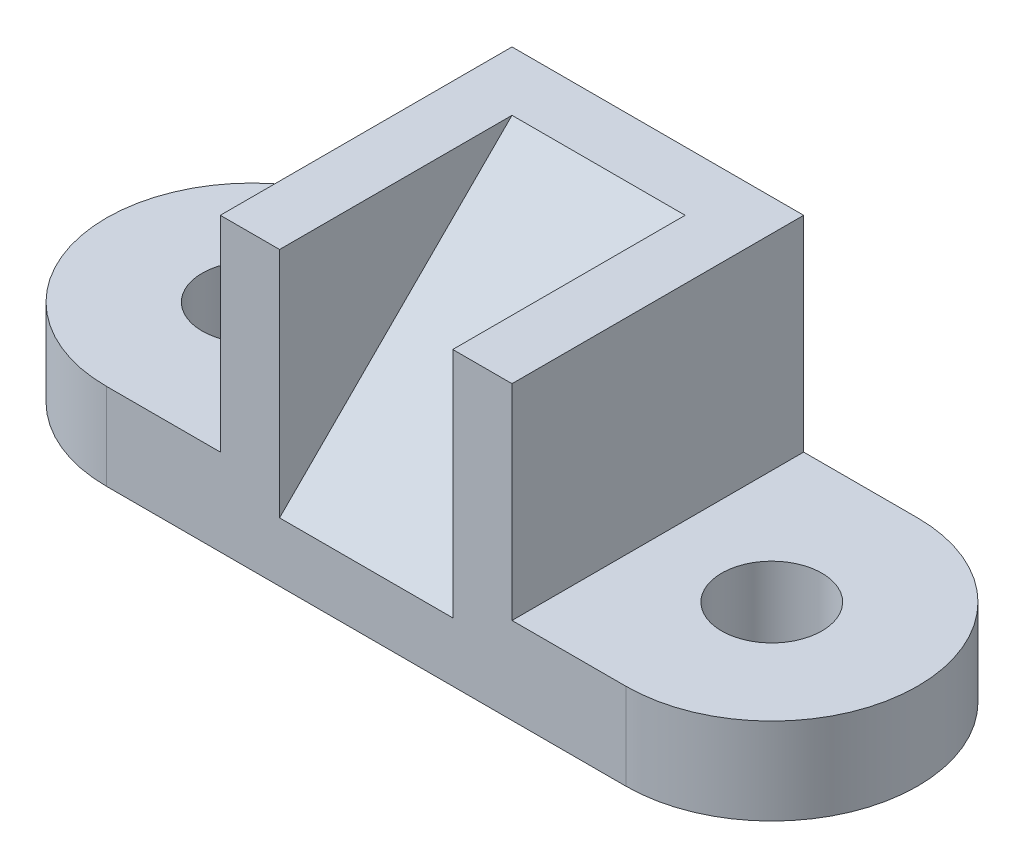
ISO-10303-21;
HEADER;
FILE_DESCRIPTION(('STEP AP214'),'2;1');
FILE_NAME('part.step','',(''),(''),'','','');
FILE_SCHEMA(('AUTOMOTIVE_DESIGN { 1 0 10303 214 1 1 1 1 }'));
ENDSEC;
DATA;
#1=APPLICATION_CONTEXT('core data for automotive mechanical design processes');
#2=APPLICATION_PROTOCOL_DEFINITION('international standard','automotive_design',2000,#1);
#3=PRODUCT_CONTEXT('',#1,'mechanical');
#4=PRODUCT('Part','Part','',(#3));
#5=PRODUCT_RELATED_PRODUCT_CATEGORY('part','',(#4));
#6=PRODUCT_DEFINITION_FORMATION('','',#4);
#7=PRODUCT_DEFINITION_CONTEXT('part definition',#1,'design');
#8=PRODUCT_DEFINITION('design','',#6,#7);
#9=PRODUCT_DEFINITION_SHAPE('','',#8);
#10=(LENGTH_UNIT() NAMED_UNIT(*) SI_UNIT(.MILLI.,.METRE.));
#11=(NAMED_UNIT(*) PLANE_ANGLE_UNIT() SI_UNIT($,.RADIAN.));
#12=(NAMED_UNIT(*) SI_UNIT($,.STERADIAN.) SOLID_ANGLE_UNIT());
#13=UNCERTAINTY_MEASURE_WITH_UNIT(LENGTH_MEASURE(1.E-05),#10,'distance_accuracy_value','');
#14=(GEOMETRIC_REPRESENTATION_CONTEXT(3) GLOBAL_UNCERTAINTY_ASSIGNED_CONTEXT((#13)) GLOBAL_UNIT_ASSIGNED_CONTEXT((#10,
#11,#12)) REPRESENTATION_CONTEXT('',''));
#15=CARTESIAN_POINT('',(0.,0.,0.));
#16=DIRECTION('',(0.,0.,1.));
#17=DIRECTION('',(1.,0.,0.));
#18=AXIS2_PLACEMENT_3D('',#15,#16,#17);
#19=CARTESIAN_POINT('',(0.,19.,0.));
#20=DIRECTION('',(0.,1.,0.));
#21=DIRECTION('',(0.,0.,1.));
#22=AXIS2_PLACEMENT_3D('',#19,#20,#21);
#23=PLANE('',#22);
#24=DIRECTION('',(0.,0.,1.));
#25=VECTOR('',#24,1.);
#26=CARTESIAN_POINT('',(25.,19.,-32.));
#27=LINE('',#26,#25);
#28=CARTESIAN_POINT('',(25.,19.,-32.));
#29=VERTEX_POINT('',#28);
#30=CARTESIAN_POINT('',(25.,19.,32.));
#31=VERTEX_POINT('',#30);
#32=EDGE_CURVE('E62',#29,#31,#27,.T.);
#33=ORIENTED_EDGE('',*,*,#32,.F.);
#34=DIRECTION('',(-1.,0.,0.));
#35=VECTOR('',#34,1.);
#36=CARTESIAN_POINT('',(0.,19.,-32.));
#37=LINE('',#36,#35);
#38=CARTESIAN_POINT('',(0.,19.,-32.));
#39=VERTEX_POINT('',#38);
#40=EDGE_CURVE('E196',#29,#39,#37,.T.);
#41=ORIENTED_EDGE('',*,*,#40,.T.);
#42=CARTESIAN_POINT('',(0.,19.,0.));
#43=DIRECTION('',(0.,1.,0.));
#44=DIRECTION('',(0.,0.,1.));
#45=AXIS2_PLACEMENT_3D('',#42,#43,#44);
#46=CIRCLE('',#45,32.);
#47=CARTESIAN_POINT('',(0.,19.,32.));
#48=VERTEX_POINT('',#47);
#49=EDGE_CURVE('E187',#39,#48,#46,.T.);
#50=ORIENTED_EDGE('',*,*,#49,.T.);
#51=DIRECTION('',(1.,0.,0.));
#52=VECTOR('',#51,1.);
#53=CARTESIAN_POINT('',(0.,19.,32.));
#54=LINE('',#53,#52);
#55=EDGE_CURVE('E192',#48,#31,#54,.T.);
#56=ORIENTED_EDGE('',*,*,#55,.T.);
#57=EDGE_LOOP('',(#33,#41,#50,#56));
#58=FACE_BOUND('',#57,.T.);
#59=CARTESIAN_POINT('',(0.,19.,0.));
#60=DIRECTION('',(0.,1.,0.));
#61=DIRECTION('',(0.,0.,1.));
#62=AXIS2_PLACEMENT_3D('',#59,#60,#61);
#63=CIRCLE('',#62,11.);
#64=CARTESIAN_POINT('',(0.,19.,11.));
#65=VERTEX_POINT('',#64);
#66=EDGE_CURVE('E181',#65,#65,#63,.T.);
#67=ORIENTED_EDGE('',*,*,#66,.F.);
#68=EDGE_LOOP('',(#67));
#69=FACE_BOUND('',#68,.T.);
#70=ADVANCED_FACE('F39',(#58,#69),#23,.T.);
#71=DIRECTION('',(0.,0.,-1.));
#72=VECTOR('',#71,1.);
#73=CARTESIAN_POINT('',(89.,19.,-32.));
#74=LINE('',#73,#72);
#75=CARTESIAN_POINT('',(89.,19.,32.));
#76=VERTEX_POINT('',#75);
#77=CARTESIAN_POINT('',(89.,19.,-32.));
#78=VERTEX_POINT('',#77);
#79=EDGE_CURVE('E152',#76,#78,#74,.T.);
#80=ORIENTED_EDGE('',*,*,#79,.F.);
#81=CARTESIAN_POINT('',(114.,19.,32.));
#82=VERTEX_POINT('',#81);
#83=EDGE_CURVE('E190',#76,#82,#54,.T.);
#84=ORIENTED_EDGE('',*,*,#83,.T.);
#85=CARTESIAN_POINT('',(114.,19.,0.));
#86=DIRECTION('',(0.,1.,0.));
#87=DIRECTION('',(0.,0.,1.));
#88=AXIS2_PLACEMENT_3D('',#85,#86,#87);
#89=CIRCLE('',#88,32.);
#90=CARTESIAN_POINT('',(114.,19.,-32.));
#91=VERTEX_POINT('',#90);
#92=EDGE_CURVE('E194',#82,#91,#89,.T.);
#93=ORIENTED_EDGE('',*,*,#92,.T.);
#94=EDGE_CURVE('E197',#91,#78,#37,.T.);
#95=ORIENTED_EDGE('',*,*,#94,.T.);
#96=EDGE_LOOP('',(#80,#84,#93,#95));
#97=FACE_BOUND('',#96,.T.);
#98=CARTESIAN_POINT('',(114.,19.,0.));
#99=DIRECTION('',(0.,1.,0.));
#100=DIRECTION('',(0.,0.,1.));
#101=AXIS2_PLACEMENT_3D('',#98,#99,#100);
#102=CIRCLE('',#101,11.);
#103=CARTESIAN_POINT('',(114.,19.,11.));
#104=VERTEX_POINT('',#103);
#105=EDGE_CURVE('E175',#104,#104,#102,.T.);
#106=ORIENTED_EDGE('',*,*,#105,.F.);
#107=EDGE_LOOP('',(#106));
#108=FACE_BOUND('',#107,.T.);
#109=ADVANCED_FACE('F245',(#97,#108),#23,.T.);
#110=CARTESIAN_POINT('',(0.,0.,0.));
#111=DIRECTION('',(0.,1.,0.));
#112=DIRECTION('',(0.,0.,1.));
#113=AXIS2_PLACEMENT_3D('',#110,#111,#112);
#114=PLANE('',#113);
#115=CARTESIAN_POINT('',(0.,0.,0.));
#116=DIRECTION('',(0.,1.,0.));
#117=DIRECTION('',(0.,0.,1.));
#118=AXIS2_PLACEMENT_3D('',#115,#116,#117);
#119=CIRCLE('',#118,32.);
#120=CARTESIAN_POINT('',(0.,0.,-32.));
#121=VERTEX_POINT('',#120);
#122=CARTESIAN_POINT('',(0.,0.,32.));
#123=VERTEX_POINT('',#122);
#124=EDGE_CURVE('E184',#121,#123,#119,.T.);
#125=ORIENTED_EDGE('',*,*,#124,.F.);
#126=DIRECTION('',(-1.,0.,0.));
#127=VECTOR('',#126,1.);
#128=CARTESIAN_POINT('',(0.,0.,-32.));
#129=LINE('',#128,#127);
#130=CARTESIAN_POINT('',(114.,0.,-32.));
#131=VERTEX_POINT('',#130);
#132=EDGE_CURVE('E191',#131,#121,#129,.T.);
#133=ORIENTED_EDGE('',*,*,#132,.F.);
#134=CARTESIAN_POINT('',(114.,0.,0.));
#135=DIRECTION('',(0.,1.,0.));
#136=DIRECTION('',(0.,0.,1.));
#137=AXIS2_PLACEMENT_3D('',#134,#135,#136);
#138=CIRCLE('',#137,32.);
#139=CARTESIAN_POINT('',(114.,0.,32.));
#140=VERTEX_POINT('',#139);
#141=EDGE_CURVE('E204',#140,#131,#138,.T.);
#142=ORIENTED_EDGE('',*,*,#141,.F.);
#143=DIRECTION('',(1.,0.,0.));
#144=VECTOR('',#143,1.);
#145=CARTESIAN_POINT('',(0.,0.,32.));
#146=LINE('',#145,#144);
#147=EDGE_CURVE('E202',#123,#140,#146,.T.);
#148=ORIENTED_EDGE('',*,*,#147,.F.);
#149=EDGE_LOOP('',(#125,#133,#142,#148));
#150=FACE_BOUND('',#149,.T.);
#151=CARTESIAN_POINT('',(0.,0.,0.));
#152=DIRECTION('',(0.,1.,0.));
#153=DIRECTION('',(0.,0.,1.));
#154=AXIS2_PLACEMENT_3D('',#151,#152,#153);
#155=CIRCLE('',#154,11.);
#156=CARTESIAN_POINT('',(0.,0.,11.));
#157=VERTEX_POINT('',#156);
#158=EDGE_CURVE('E178',#157,#157,#155,.T.);
#159=ORIENTED_EDGE('',*,*,#158,.T.);
#160=EDGE_LOOP('',(#159));
#161=FACE_BOUND('',#160,.T.);
#162=CARTESIAN_POINT('',(114.,0.,0.));
#163=DIRECTION('',(0.,1.,0.));
#164=DIRECTION('',(0.,0.,1.));
#165=AXIS2_PLACEMENT_3D('',#162,#163,#164);
#166=CIRCLE('',#165,11.);
#167=CARTESIAN_POINT('',(114.,0.,11.));
#168=VERTEX_POINT('',#167);
#169=EDGE_CURVE('E174',#168,#168,#166,.T.);
#170=ORIENTED_EDGE('',*,*,#169,.T.);
#171=EDGE_LOOP('',(#170));
#172=FACE_BOUND('',#171,.T.);
#173=ADVANCED_FACE('F223',(#150,#161,#172),#114,.F.);
#174=CARTESIAN_POINT('',(0.,19.,0.));
#175=DIRECTION('',(0.,-1.,0.));
#176=DIRECTION('',(0.,0.,-1.));
#177=AXIS2_PLACEMENT_3D('',#174,#175,#176);
#178=CYLINDRICAL_SURFACE('',#177,32.);
#179=ORIENTED_EDGE('',*,*,#124,.T.);
#180=DIRECTION('',(0.,-1.,0.));
#181=VECTOR('',#180,1.);
#182=CARTESIAN_POINT('',(0.,19.,32.));
#183=LINE('',#182,#181);
#184=EDGE_CURVE('E11',#48,#123,#183,.T.);
#185=ORIENTED_EDGE('',*,*,#184,.F.);
#186=ORIENTED_EDGE('',*,*,#49,.F.);
#187=DIRECTION('',(0.,-1.,0.));
#188=VECTOR('',#187,1.);
#189=CARTESIAN_POINT('',(0.,19.,-32.));
#190=LINE('',#189,#188);
#191=EDGE_CURVE('E199',#39,#121,#190,.T.);
#192=ORIENTED_EDGE('',*,*,#191,.T.);
#193=EDGE_LOOP('',(#179,#185,#186,#192));
#194=FACE_BOUND('',#193,.T.);
#195=ADVANCED_FACE('F41',(#194),#178,.T.);
#196=CARTESIAN_POINT('',(0.,19.,32.));
#197=DIRECTION('',(0.,0.,-1.));
#198=DIRECTION('',(-1.,0.,0.));
#199=AXIS2_PLACEMENT_3D('',#196,#197,#198);
#200=PLANE('',#199);
#201=DIRECTION('',(1.,0.,0.));
#202=VECTOR('',#201,1.);
#203=CARTESIAN_POINT('',(25.,64.,32.));
#204=LINE('',#203,#202);
#205=CARTESIAN_POINT('',(76.,64.,32.));
#206=VERTEX_POINT('',#205);
#207=CARTESIAN_POINT('',(89.,64.,32.));
#208=VERTEX_POINT('',#207);
#209=EDGE_CURVE('E151',#206,#208,#204,.T.);
#210=ORIENTED_EDGE('',*,*,#209,.F.);
#211=DIRECTION('',(0.,1.,0.));
#212=VECTOR('',#211,1.);
#213=CARTESIAN_POINT('',(76.,13.,32.));
#214=LINE('',#213,#212);
#215=CARTESIAN_POINT('',(76.,13.,32.));
#216=VERTEX_POINT('',#215);
#217=EDGE_CURVE('E131',#216,#206,#214,.T.);
#218=ORIENTED_EDGE('',*,*,#217,.F.);
#219=DIRECTION('',(-1.,0.,0.));
#220=VECTOR('',#219,1.);
#221=CARTESIAN_POINT('',(76.,13.,32.));
#222=LINE('',#221,#220);
#223=CARTESIAN_POINT('',(38.,13.,32.));
#224=VERTEX_POINT('',#223);
#225=EDGE_CURVE('E128',#216,#224,#222,.T.);
#226=ORIENTED_EDGE('',*,*,#225,.T.);
#227=DIRECTION('',(0.,1.,0.));
#228=VECTOR('',#227,1.);
#229=CARTESIAN_POINT('',(38.,13.,32.));
#230=LINE('',#229,#228);
#231=CARTESIAN_POINT('',(38.,64.,32.));
#232=VERTEX_POINT('',#231);
#233=EDGE_CURVE('E138',#224,#232,#230,.T.);
#234=ORIENTED_EDGE('',*,*,#233,.T.);
#235=CARTESIAN_POINT('',(25.,64.,32.));
#236=VERTEX_POINT('',#235);
#237=EDGE_CURVE('E153',#236,#232,#204,.T.);
#238=ORIENTED_EDGE('',*,*,#237,.F.);
#239=DIRECTION('',(0.,-1.,0.));
#240=VECTOR('',#239,1.);
#241=CARTESIAN_POINT('',(25.,64.,32.));
#242=LINE('',#241,#240);
#243=EDGE_CURVE('E171',#236,#31,#242,.T.);
#244=ORIENTED_EDGE('',*,*,#243,.T.);
#245=ORIENTED_EDGE('',*,*,#55,.F.);
#246=ORIENTED_EDGE('',*,*,#184,.T.);
#247=ORIENTED_EDGE('',*,*,#147,.T.);
#248=DIRECTION('',(0.,-1.,0.));
#249=VECTOR('',#248,1.);
#250=CARTESIAN_POINT('',(114.,19.,32.));
#251=LINE('',#250,#249);
#252=EDGE_CURVE('E47',#82,#140,#251,.T.);
#253=ORIENTED_EDGE('',*,*,#252,.F.);
#254=ORIENTED_EDGE('',*,*,#83,.F.);
#255=DIRECTION('',(0.,-1.,0.));
#256=VECTOR('',#255,1.);
#257=CARTESIAN_POINT('',(89.,64.,32.));
#258=LINE('',#257,#256);
#259=EDGE_CURVE('E168',#208,#76,#258,.T.);
#260=ORIENTED_EDGE('',*,*,#259,.F.);
#261=EDGE_LOOP('',(#210,#218,#226,#234,#238,#244,#245,#246,#247,#253,#254,#260));
#262=FACE_BOUND('',#261,.T.);
#263=ADVANCED_FACE('F247',(#262),#200,.F.);
#264=CARTESIAN_POINT('',(114.,19.,0.));
#265=DIRECTION('',(0.,-1.,0.));
#266=DIRECTION('',(0.,0.,-1.));
#267=AXIS2_PLACEMENT_3D('',#264,#265,#266);
#268=CYLINDRICAL_SURFACE('',#267,32.);
#269=ORIENTED_EDGE('',*,*,#141,.T.);
#270=DIRECTION('',(0.,-1.,0.));
#271=VECTOR('',#270,1.);
#272=CARTESIAN_POINT('',(114.,19.,-32.));
#273=LINE('',#272,#271);
#274=EDGE_CURVE('E209',#91,#131,#273,.T.);
#275=ORIENTED_EDGE('',*,*,#274,.F.);
#276=ORIENTED_EDGE('',*,*,#92,.F.);
#277=ORIENTED_EDGE('',*,*,#252,.T.);
#278=EDGE_LOOP('',(#269,#275,#276,#277));
#279=FACE_BOUND('',#278,.T.);
#280=ADVANCED_FACE('F216',(#279),#268,.T.);
#281=CARTESIAN_POINT('',(0.,19.,-32.));
#282=DIRECTION('',(0.,0.,1.));
#283=DIRECTION('',(1.,0.,0.));
#284=AXIS2_PLACEMENT_3D('',#281,#282,#283);
#285=PLANE('',#284);
#286=ORIENTED_EDGE('',*,*,#132,.T.);
#287=ORIENTED_EDGE('',*,*,#191,.F.);
#288=ORIENTED_EDGE('',*,*,#40,.F.);
#289=DIRECTION('',(0.,-1.,0.));
#290=VECTOR('',#289,1.);
#291=CARTESIAN_POINT('',(25.,64.,-32.));
#292=LINE('',#291,#290);
#293=CARTESIAN_POINT('',(25.,64.,-32.));
#294=VERTEX_POINT('',#293);
#295=EDGE_CURVE('E159',#294,#29,#292,.T.);
#296=ORIENTED_EDGE('',*,*,#295,.F.);
#297=DIRECTION('',(-1.,0.,0.));
#298=VECTOR('',#297,1.);
#299=CARTESIAN_POINT('',(25.,64.,-32.));
#300=LINE('',#299,#298);
#301=CARTESIAN_POINT('',(89.,64.,-32.));
#302=VERTEX_POINT('',#301);
#303=EDGE_CURVE('E157',#302,#294,#300,.T.);
#304=ORIENTED_EDGE('',*,*,#303,.F.);
#305=DIRECTION('',(0.,-1.,0.));
#306=VECTOR('',#305,1.);
#307=CARTESIAN_POINT('',(89.,64.,-32.));
#308=LINE('',#307,#306);
#309=EDGE_CURVE('E165',#302,#78,#308,.T.);
#310=ORIENTED_EDGE('',*,*,#309,.T.);
#311=ORIENTED_EDGE('',*,*,#94,.F.);
#312=ORIENTED_EDGE('',*,*,#274,.T.);
#313=EDGE_LOOP('',(#286,#287,#288,#296,#304,#310,#311,#312));
#314=FACE_BOUND('',#313,.T.);
#315=ADVANCED_FACE('F227',(#314),#285,.F.);
#316=CARTESIAN_POINT('',(0.,19.,0.));
#317=DIRECTION('',(0.,-1.,0.));
#318=DIRECTION('',(0.,0.,-1.));
#319=AXIS2_PLACEMENT_3D('',#316,#317,#318);
#320=CYLINDRICAL_SURFACE('',#319,11.);
#321=ORIENTED_EDGE('',*,*,#66,.T.);
#322=EDGE_LOOP('',(#321));
#323=FACE_BOUND('',#322,.T.);
#324=ORIENTED_EDGE('',*,*,#158,.F.);
#325=EDGE_LOOP('',(#324));
#326=FACE_BOUND('',#325,.T.);
#327=ADVANCED_FACE('F267',(#323,#326),#320,.F.);
#328=CARTESIAN_POINT('',(114.,19.,0.));
#329=DIRECTION('',(0.,-1.,0.));
#330=DIRECTION('',(0.,0.,-1.));
#331=AXIS2_PLACEMENT_3D('',#328,#329,#330);
#332=CYLINDRICAL_SURFACE('',#331,11.);
#333=ORIENTED_EDGE('',*,*,#105,.T.);
#334=EDGE_LOOP('',(#333));
#335=FACE_BOUND('',#334,.T.);
#336=ORIENTED_EDGE('',*,*,#169,.F.);
#337=EDGE_LOOP('',(#336));
#338=FACE_BOUND('',#337,.T.);
#339=ADVANCED_FACE('F297',(#335,#338),#332,.F.);
#340=CARTESIAN_POINT('',(25.,64.,-32.));
#341=DIRECTION('',(1.,0.,0.));
#342=DIRECTION('',(0.,0.,-1.));
#343=AXIS2_PLACEMENT_3D('',#340,#341,#342);
#344=PLANE('',#343);
#345=ORIENTED_EDGE('',*,*,#32,.T.);
#346=ORIENTED_EDGE('',*,*,#243,.F.);
#347=DIRECTION('',(0.,0.,1.));
#348=VECTOR('',#347,1.);
#349=CARTESIAN_POINT('',(25.,64.,-32.));
#350=LINE('',#349,#348);
#351=EDGE_CURVE('E148',#294,#236,#350,.T.);
#352=ORIENTED_EDGE('',*,*,#351,.F.);
#353=ORIENTED_EDGE('',*,*,#295,.T.);
#354=EDGE_LOOP('',(#345,#346,#352,#353));
#355=FACE_BOUND('',#354,.T.);
#356=ADVANCED_FACE('F237',(#355),#344,.F.);
#357=CARTESIAN_POINT('',(89.,64.,-32.));
#358=DIRECTION('',(-1.,0.,0.));
#359=DIRECTION('',(0.,0.,1.));
#360=AXIS2_PLACEMENT_3D('',#357,#358,#359);
#361=PLANE('',#360);
#362=ORIENTED_EDGE('',*,*,#79,.T.);
#363=ORIENTED_EDGE('',*,*,#309,.F.);
#364=DIRECTION('',(0.,0.,-1.));
#365=VECTOR('',#364,1.);
#366=CARTESIAN_POINT('',(89.,64.,-32.));
#367=LINE('',#366,#365);
#368=EDGE_CURVE('E155',#208,#302,#367,.T.);
#369=ORIENTED_EDGE('',*,*,#368,.F.);
#370=ORIENTED_EDGE('',*,*,#259,.T.);
#371=EDGE_LOOP('',(#362,#363,#369,#370));
#372=FACE_BOUND('',#371,.T.);
#373=ADVANCED_FACE('F242',(#372),#361,.F.);
#374=CARTESIAN_POINT('',(0.,64.,0.));
#375=DIRECTION('',(0.,1.,0.));
#376=DIRECTION('',(0.,0.,1.));
#377=AXIS2_PLACEMENT_3D('',#374,#375,#376);
#378=PLANE('',#377);
#379=DIRECTION('',(0.,0.,-1.));
#380=VECTOR('',#379,1.);
#381=CARTESIAN_POINT('',(76.,64.,32.));
#382=LINE('',#381,#380);
#383=CARTESIAN_POINT('',(76.,64.,-19.));
#384=VERTEX_POINT('',#383);
#385=EDGE_CURVE('E132',#206,#384,#382,.T.);
#386=ORIENTED_EDGE('',*,*,#385,.F.);
#387=ORIENTED_EDGE('',*,*,#209,.T.);
#388=ORIENTED_EDGE('',*,*,#368,.T.);
#389=ORIENTED_EDGE('',*,*,#303,.T.);
#390=ORIENTED_EDGE('',*,*,#351,.T.);
#391=ORIENTED_EDGE('',*,*,#237,.T.);
#392=DIRECTION('',(0.,0.,-1.));
#393=VECTOR('',#392,1.);
#394=CARTESIAN_POINT('',(38.,64.,32.));
#395=LINE('',#394,#393);
#396=CARTESIAN_POINT('',(38.,64.,-19.));
#397=VERTEX_POINT('',#396);
#398=EDGE_CURVE('E142',#232,#397,#395,.T.);
#399=ORIENTED_EDGE('',*,*,#398,.T.);
#400=DIRECTION('',(-1.,0.,0.));
#401=VECTOR('',#400,1.);
#402=CARTESIAN_POINT('',(76.,64.,-19.));
#403=LINE('',#402,#401);
#404=EDGE_CURVE('E125',#384,#397,#403,.T.);
#405=ORIENTED_EDGE('',*,*,#404,.F.);
#406=EDGE_LOOP('',(#386,#387,#388,#389,#390,#391,#399,#405));
#407=FACE_BOUND('',#406,.T.);
#408=ADVANCED_FACE('F140',(#407),#378,.T.);
#409=CARTESIAN_POINT('',(76.,64.,-19.));
#410=DIRECTION('',(0.,-0.707106781186548,-0.707106781186548));
#411=DIRECTION('',(0.,0.707106781186548,-0.707106781186547));
#412=AXIS2_PLACEMENT_3D('',#409,#410,#411);
#413=PLANE('',#412);
#414=DIRECTION('',(0.,-0.707106781186548,0.707106781186547));
#415=VECTOR('',#414,1.);
#416=CARTESIAN_POINT('',(38.,64.,-19.));
#417=LINE('',#416,#415);
#418=EDGE_CURVE('E54',#397,#224,#417,.T.);
#419=ORIENTED_EDGE('',*,*,#418,.T.);
#420=ORIENTED_EDGE('',*,*,#225,.F.);
#421=DIRECTION('',(0.,-0.707106781186548,0.707106781186547));
#422=VECTOR('',#421,1.);
#423=CARTESIAN_POINT('',(76.,64.,-19.));
#424=LINE('',#423,#422);
#425=EDGE_CURVE('E121',#384,#216,#424,.T.);
#426=ORIENTED_EDGE('',*,*,#425,.F.);
#427=ORIENTED_EDGE('',*,*,#404,.T.);
#428=EDGE_LOOP('',(#419,#420,#426,#427));
#429=FACE_BOUND('',#428,.T.);
#430=ADVANCED_FACE('F123',(#429),#413,.F.);
#431=CARTESIAN_POINT('',(76.,0.,0.));
#432=DIRECTION('',(1.,0.,0.));
#433=DIRECTION('',(0.,0.,-1.));
#434=AXIS2_PLACEMENT_3D('',#431,#432,#433);
#435=PLANE('',#434);
#436=ORIENTED_EDGE('',*,*,#385,.T.);
#437=ORIENTED_EDGE('',*,*,#425,.T.);
#438=ORIENTED_EDGE('',*,*,#217,.T.);
#439=EDGE_LOOP('',(#436,#437,#438));
#440=FACE_BOUND('',#439,.T.);
#441=ADVANCED_FACE('F135',(#440),#435,.F.);
#442=CARTESIAN_POINT('',(38.,0.,0.));
#443=DIRECTION('',(1.,0.,0.));
#444=DIRECTION('',(0.,0.,-1.));
#445=AXIS2_PLACEMENT_3D('',#442,#443,#444);
#446=PLANE('',#445);
#447=ORIENTED_EDGE('',*,*,#398,.F.);
#448=ORIENTED_EDGE('',*,*,#233,.F.);
#449=ORIENTED_EDGE('',*,*,#418,.F.);
#450=EDGE_LOOP('',(#447,#448,#449));
#451=FACE_BOUND('',#450,.T.);
#452=ADVANCED_FACE('F251',(#451),#446,.T.);
#453=CLOSED_SHELL('',(#70,#109,#173,#195,#263,#280,#315,#327,#339,#356,#373,#408,#430,#441,#452));
#454=MANIFOLD_SOLID_BREP('B2',#453);
#455=ADVANCED_BREP_SHAPE_REPRESENTATION('',(#18,#454),#14);
#456=SHAPE_DEFINITION_REPRESENTATION(#9,#455);
ENDSEC;
END-ISO-10303-21;
